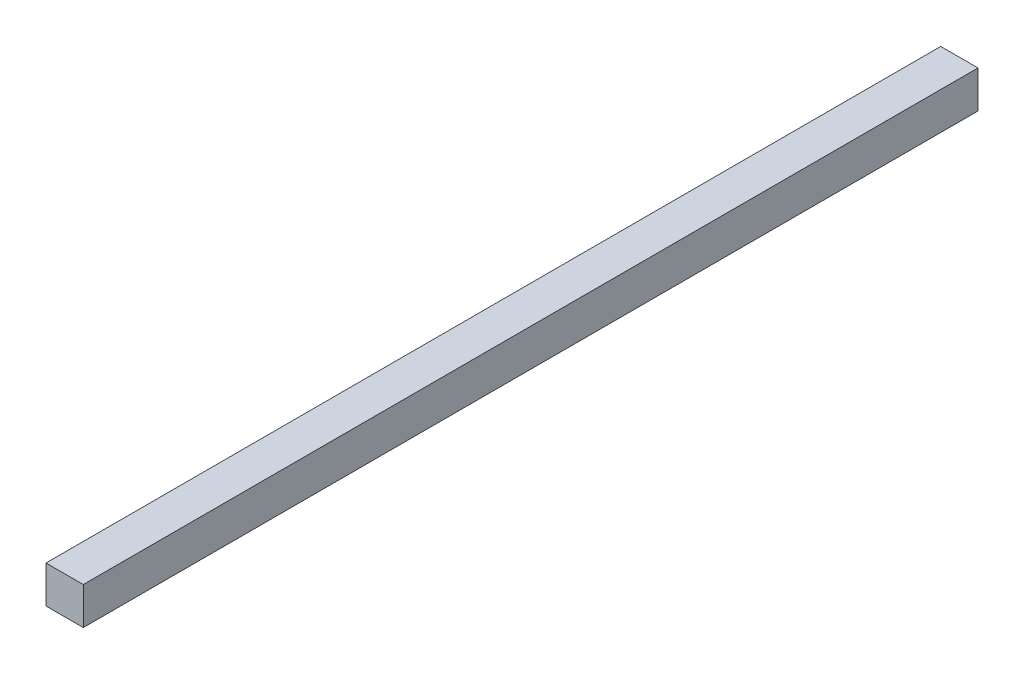
ISO-10303-21;
HEADER;
FILE_DESCRIPTION(('STEP AP214'),'2;1');
FILE_NAME('part.step','',(''),(''),'','','');
FILE_SCHEMA(('AUTOMOTIVE_DESIGN { 1 0 10303 214 1 1 1 1 }'));
ENDSEC;
DATA;
#1=APPLICATION_CONTEXT('core data for automotive mechanical design processes');
#2=APPLICATION_PROTOCOL_DEFINITION('international standard','automotive_design',2000,#1);
#3=PRODUCT_CONTEXT('',#1,'mechanical');
#4=PRODUCT('Part','Part','',(#3));
#5=PRODUCT_RELATED_PRODUCT_CATEGORY('part','',(#4));
#6=PRODUCT_DEFINITION_FORMATION('','',#4);
#7=PRODUCT_DEFINITION_CONTEXT('part definition',#1,'design');
#8=PRODUCT_DEFINITION('design','',#6,#7);
#9=PRODUCT_DEFINITION_SHAPE('','',#8);
#10=(LENGTH_UNIT() NAMED_UNIT(*) SI_UNIT(.MILLI.,.METRE.));
#11=(NAMED_UNIT(*) PLANE_ANGLE_UNIT() SI_UNIT($,.RADIAN.));
#12=(NAMED_UNIT(*) SI_UNIT($,.STERADIAN.) SOLID_ANGLE_UNIT());
#13=UNCERTAINTY_MEASURE_WITH_UNIT(LENGTH_MEASURE(1.E-05),#10,'distance_accuracy_value','');
#14=(GEOMETRIC_REPRESENTATION_CONTEXT(3) GLOBAL_UNCERTAINTY_ASSIGNED_CONTEXT((#13)) GLOBAL_UNIT_ASSIGNED_CONTEXT((#10,
#11,#12)) REPRESENTATION_CONTEXT('',''));
#15=CARTESIAN_POINT('',(0.,0.,0.));
#16=DIRECTION('',(0.,0.,1.));
#17=DIRECTION('',(1.,0.,0.));
#18=AXIS2_PLACEMENT_3D('',#15,#16,#17);
#19=CARTESIAN_POINT('',(0.,0.,152.4));
#20=DIRECTION('',(1.,0.,0.));
#21=DIRECTION('',(0.,0.,-1.));
#22=AXIS2_PLACEMENT_3D('',#19,#20,#21);
#23=PLANE('',#22);
#24=DIRECTION('',(0.,-1.,0.));
#25=VECTOR('',#24,1.);
#26=CARTESIAN_POINT('',(0.,0.,0.));
#27=LINE('',#26,#25);
#28=CARTESIAN_POINT('',(0.,6.35,0.));
#29=VERTEX_POINT('',#28);
#30=CARTESIAN_POINT('',(0.,0.,0.));
#31=VERTEX_POINT('',#30);
#32=EDGE_CURVE('E107',#29,#31,#27,.T.);
#33=ORIENTED_EDGE('',*,*,#32,.T.);
#34=DIRECTION('',(0.,0.,-1.));
#35=VECTOR('',#34,1.);
#36=CARTESIAN_POINT('',(0.,0.,152.4));
#37=LINE('',#36,#35);
#38=CARTESIAN_POINT('',(0.,0.,152.4));
#39=VERTEX_POINT('',#38);
#40=EDGE_CURVE('E11',#39,#31,#37,.T.);
#41=ORIENTED_EDGE('',*,*,#40,.F.);
#42=DIRECTION('',(0.,-1.,0.));
#43=VECTOR('',#42,1.);
#44=CARTESIAN_POINT('',(0.,0.,152.4));
#45=LINE('',#44,#43);
#46=CARTESIAN_POINT('',(0.,6.35,152.4));
#47=VERTEX_POINT('',#46);
#48=EDGE_CURVE('E91',#47,#39,#45,.T.);
#49=ORIENTED_EDGE('',*,*,#48,.F.);
#50=DIRECTION('',(0.,0.,-1.));
#51=VECTOR('',#50,1.);
#52=CARTESIAN_POINT('',(0.,6.35,152.4));
#53=LINE('',#52,#51);
#54=EDGE_CURVE('E103',#47,#29,#53,.T.);
#55=ORIENTED_EDGE('',*,*,#54,.T.);
#56=EDGE_LOOP('',(#33,#41,#49,#55));
#57=FACE_BOUND('',#56,.T.);
#58=ADVANCED_FACE('F39',(#57),#23,.F.);
#59=CARTESIAN_POINT('',(0.,0.,152.4));
#60=DIRECTION('',(0.,1.,0.));
#61=DIRECTION('',(0.,0.,1.));
#62=AXIS2_PLACEMENT_3D('',#59,#60,#61);
#63=PLANE('',#62);
#64=DIRECTION('',(1.,0.,0.));
#65=VECTOR('',#64,1.);
#66=CARTESIAN_POINT('',(0.,0.,0.));
#67=LINE('',#66,#65);
#68=CARTESIAN_POINT('',(6.35,0.,0.));
#69=VERTEX_POINT('',#68);
#70=EDGE_CURVE('E96',#31,#69,#67,.T.);
#71=ORIENTED_EDGE('',*,*,#70,.T.);
#72=DIRECTION('',(0.,0.,-1.));
#73=VECTOR('',#72,1.);
#74=CARTESIAN_POINT('',(6.35,0.,152.4));
#75=LINE('',#74,#73);
#76=CARTESIAN_POINT('',(6.35,0.,152.4));
#77=VERTEX_POINT('',#76);
#78=EDGE_CURVE('E48',#77,#69,#75,.T.);
#79=ORIENTED_EDGE('',*,*,#78,.F.);
#80=DIRECTION('',(1.,0.,0.));
#81=VECTOR('',#80,1.);
#82=CARTESIAN_POINT('',(0.,0.,152.4));
#83=LINE('',#82,#81);
#84=EDGE_CURVE('E86',#39,#77,#83,.T.);
#85=ORIENTED_EDGE('',*,*,#84,.F.);
#86=ORIENTED_EDGE('',*,*,#40,.T.);
#87=EDGE_LOOP('',(#71,#79,#85,#86));
#88=FACE_BOUND('',#87,.T.);
#89=ADVANCED_FACE('F95',(#88),#63,.F.);
#90=CARTESIAN_POINT('',(6.35,0.,152.4));
#91=DIRECTION('',(-1.,0.,0.));
#92=DIRECTION('',(0.,0.,1.));
#93=AXIS2_PLACEMENT_3D('',#90,#91,#92);
#94=PLANE('',#93);
#95=DIRECTION('',(0.,1.,0.));
#96=VECTOR('',#95,1.);
#97=CARTESIAN_POINT('',(6.35,0.,0.));
#98=LINE('',#97,#96);
#99=CARTESIAN_POINT('',(6.35,6.35,0.));
#100=VERTEX_POINT('',#99);
#101=EDGE_CURVE('E73',#69,#100,#98,.T.);
#102=ORIENTED_EDGE('',*,*,#101,.T.);
#103=DIRECTION('',(0.,0.,-1.));
#104=VECTOR('',#103,1.);
#105=CARTESIAN_POINT('',(6.35,6.35,152.4));
#106=LINE('',#105,#104);
#107=CARTESIAN_POINT('',(6.35,6.35,152.4));
#108=VERTEX_POINT('',#107);
#109=EDGE_CURVE('E98',#108,#100,#106,.T.);
#110=ORIENTED_EDGE('',*,*,#109,.F.);
#111=DIRECTION('',(0.,1.,0.));
#112=VECTOR('',#111,1.);
#113=CARTESIAN_POINT('',(6.35,0.,152.4));
#114=LINE('',#113,#112);
#115=EDGE_CURVE('E89',#77,#108,#114,.T.);
#116=ORIENTED_EDGE('',*,*,#115,.F.);
#117=ORIENTED_EDGE('',*,*,#78,.T.);
#118=EDGE_LOOP('',(#102,#110,#116,#117));
#119=FACE_BOUND('',#118,.T.);
#120=ADVANCED_FACE('F99',(#119),#94,.F.);
#121=CARTESIAN_POINT('',(0.,6.35,152.4));
#122=DIRECTION('',(0.,-1.,0.));
#123=DIRECTION('',(0.,0.,-1.));
#124=AXIS2_PLACEMENT_3D('',#121,#122,#123);
#125=PLANE('',#124);
#126=DIRECTION('',(-1.,0.,0.));
#127=VECTOR('',#126,1.);
#128=CARTESIAN_POINT('',(0.,6.35,0.));
#129=LINE('',#128,#127);
#130=EDGE_CURVE('E79',#100,#29,#129,.T.);
#131=ORIENTED_EDGE('',*,*,#130,.T.);
#132=ORIENTED_EDGE('',*,*,#54,.F.);
#133=DIRECTION('',(-1.,0.,0.));
#134=VECTOR('',#133,1.);
#135=CARTESIAN_POINT('',(0.,6.35,152.4));
#136=LINE('',#135,#134);
#137=EDGE_CURVE('E56',#108,#47,#136,.T.);
#138=ORIENTED_EDGE('',*,*,#137,.F.);
#139=ORIENTED_EDGE('',*,*,#109,.T.);
#140=EDGE_LOOP('',(#131,#132,#138,#139));
#141=FACE_BOUND('',#140,.T.);
#142=ADVANCED_FACE('F120',(#141),#125,.F.);
#143=CARTESIAN_POINT('',(0.,0.,152.4));
#144=DIRECTION('',(0.,0.,-1.));
#145=DIRECTION('',(-1.,0.,0.));
#146=AXIS2_PLACEMENT_3D('',#143,#144,#145);
#147=PLANE('',#146);
#148=ORIENTED_EDGE('',*,*,#48,.T.);
#149=ORIENTED_EDGE('',*,*,#84,.T.);
#150=ORIENTED_EDGE('',*,*,#115,.T.);
#151=ORIENTED_EDGE('',*,*,#137,.T.);
#152=EDGE_LOOP('',(#148,#149,#150,#151));
#153=FACE_BOUND('',#152,.T.);
#154=ADVANCED_FACE('F87',(#153),#147,.F.);
#155=CARTESIAN_POINT('',(0.,0.,0.));
#156=DIRECTION('',(0.,0.,-1.));
#157=DIRECTION('',(-1.,0.,0.));
#158=AXIS2_PLACEMENT_3D('',#155,#156,#157);
#159=PLANE('',#158);
#160=ORIENTED_EDGE('',*,*,#32,.F.);
#161=ORIENTED_EDGE('',*,*,#130,.F.);
#162=ORIENTED_EDGE('',*,*,#101,.F.);
#163=ORIENTED_EDGE('',*,*,#70,.F.);
#164=EDGE_LOOP('',(#160,#161,#162,#163));
#165=FACE_BOUND('',#164,.T.);
#166=ADVANCED_FACE('F123',(#165),#159,.T.);
#167=CLOSED_SHELL('',(#58,#89,#120,#142,#154,#166));
#168=MANIFOLD_SOLID_BREP('B2',#167);
#169=ADVANCED_BREP_SHAPE_REPRESENTATION('',(#18,#168),#14);
#170=SHAPE_DEFINITION_REPRESENTATION(#9,#169);
ENDSEC;
END-ISO-10303-21;
